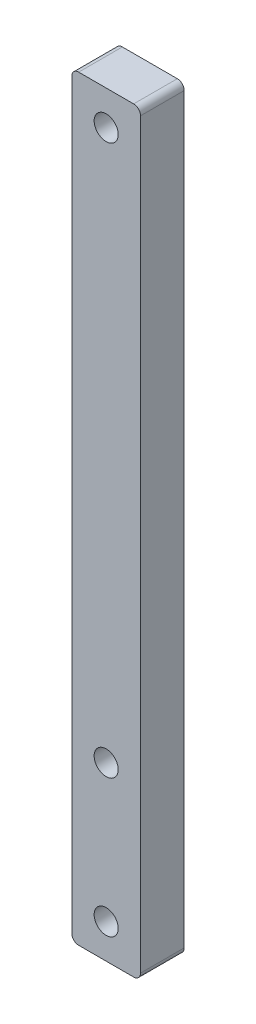
ISO-10303-21;
HEADER;
FILE_DESCRIPTION(('STEP AP214'),'2;1');
FILE_NAME('part.step','',(''),(''),'','','');
FILE_SCHEMA(('AUTOMOTIVE_DESIGN { 1 0 10303 214 1 1 1 1 }'));
ENDSEC;
DATA;
#1=APPLICATION_CONTEXT('core data for automotive mechanical design processes');
#2=APPLICATION_PROTOCOL_DEFINITION('international standard','automotive_design',2000,#1);
#3=PRODUCT_CONTEXT('',#1,'mechanical');
#4=PRODUCT('Part','Part','',(#3));
#5=PRODUCT_RELATED_PRODUCT_CATEGORY('part','',(#4));
#6=PRODUCT_DEFINITION_FORMATION('','',#4);
#7=PRODUCT_DEFINITION_CONTEXT('part definition',#1,'design');
#8=PRODUCT_DEFINITION('design','',#6,#7);
#9=PRODUCT_DEFINITION_SHAPE('','',#8);
#10=(LENGTH_UNIT() NAMED_UNIT(*) SI_UNIT(.MILLI.,.METRE.));
#11=(NAMED_UNIT(*) PLANE_ANGLE_UNIT() SI_UNIT($,.RADIAN.));
#12=(NAMED_UNIT(*) SI_UNIT($,.STERADIAN.) SOLID_ANGLE_UNIT());
#13=UNCERTAINTY_MEASURE_WITH_UNIT(LENGTH_MEASURE(1.E-05),#10,'distance_accuracy_value','');
#14=(GEOMETRIC_REPRESENTATION_CONTEXT(3) GLOBAL_UNCERTAINTY_ASSIGNED_CONTEXT((#13)) GLOBAL_UNIT_ASSIGNED_CONTEXT((#10,
#11,#12)) REPRESENTATION_CONTEXT('',''));
#15=CARTESIAN_POINT('',(0.,0.,0.));
#16=DIRECTION('',(0.,0.,1.));
#17=DIRECTION('',(1.,0.,0.));
#18=AXIS2_PLACEMENT_3D('',#15,#16,#17);
#19=CARTESIAN_POINT('',(1.,1.,6.35));
#20=DIRECTION('',(0.,0.,-1.));
#21=DIRECTION('',(-1.,0.,0.));
#22=AXIS2_PLACEMENT_3D('',#19,#20,#21);
#23=PLANE('',#22);
#24=CARTESIAN_POINT('',(5.,25.,6.35));
#25=DIRECTION('',(0.,0.,1.));
#26=DIRECTION('',(1.,0.,0.));
#27=AXIS2_PLACEMENT_3D('',#24,#25,#26);
#28=CIRCLE('',#27,1.75);
#29=CARTESIAN_POINT('',(6.75,25.,6.35));
#30=VERTEX_POINT('',#29);
#31=EDGE_CURVE('E191',#30,#30,#28,.T.);
#32=ORIENTED_EDGE('',*,*,#31,.F.);
#33=EDGE_LOOP('',(#32));
#34=FACE_BOUND('',#33,.T.);
#35=CARTESIAN_POINT('',(1.,1.,6.35));
#36=DIRECTION('',(0.,0.,1.));
#37=DIRECTION('',(-1.,0.,0.));
#38=AXIS2_PLACEMENT_3D('',#35,#36,#37);
#39=CIRCLE('',#38,1.);
#40=CARTESIAN_POINT('',(0.,1.00000000000001,6.35));
#41=VERTEX_POINT('',#40);
#42=CARTESIAN_POINT('',(1.00000000000001,0.,6.35));
#43=VERTEX_POINT('',#42);
#44=EDGE_CURVE('E145',#41,#43,#39,.T.);
#45=ORIENTED_EDGE('',*,*,#44,.T.);
#46=DIRECTION('',(1.,0.,0.));
#47=VECTOR('',#46,1.);
#48=CARTESIAN_POINT('',(1.00000000000001,0.,6.35));
#49=LINE('',#48,#47);
#50=CARTESIAN_POINT('',(8.99999999999999,0.,6.35));
#51=VERTEX_POINT('',#50);
#52=EDGE_CURVE('E93',#43,#51,#49,.T.);
#53=ORIENTED_EDGE('',*,*,#52,.T.);
#54=CARTESIAN_POINT('',(9.,1.,6.35));
#55=DIRECTION('',(0.,0.,1.));
#56=DIRECTION('',(-1.,0.,0.));
#57=AXIS2_PLACEMENT_3D('',#54,#55,#56);
#58=CIRCLE('',#57,1.);
#59=CARTESIAN_POINT('',(10.,1.00000000000001,6.35));
#60=VERTEX_POINT('',#59);
#61=EDGE_CURVE('E161',#51,#60,#58,.T.);
#62=ORIENTED_EDGE('',*,*,#61,.T.);
#63=DIRECTION('',(0.,1.,0.));
#64=VECTOR('',#63,1.);
#65=CARTESIAN_POINT('',(10.,1.00000000000001,6.35));
#66=LINE('',#65,#64);
#67=CARTESIAN_POINT('',(10.,109.,6.35));
#68=VERTEX_POINT('',#67);
#69=EDGE_CURVE('E174',#60,#68,#66,.T.);
#70=ORIENTED_EDGE('',*,*,#69,.T.);
#71=CARTESIAN_POINT('',(9.,109.,6.35));
#72=DIRECTION('',(0.,0.,1.));
#73=DIRECTION('',(-1.,0.,0.));
#74=AXIS2_PLACEMENT_3D('',#71,#72,#73);
#75=CIRCLE('',#74,1.);
#76=CARTESIAN_POINT('',(8.99999999999999,110.,6.35));
#77=VERTEX_POINT('',#76);
#78=EDGE_CURVE('E112',#68,#77,#75,.T.);
#79=ORIENTED_EDGE('',*,*,#78,.T.);
#80=DIRECTION('',(-1.,0.,0.));
#81=VECTOR('',#80,1.);
#82=CARTESIAN_POINT('',(1.00000000000001,110.,6.35));
#83=LINE('',#82,#81);
#84=CARTESIAN_POINT('',(1.00000000000001,110.,6.35));
#85=VERTEX_POINT('',#84);
#86=EDGE_CURVE('E106',#77,#85,#83,.T.);
#87=ORIENTED_EDGE('',*,*,#86,.T.);
#88=CARTESIAN_POINT('',(1.,109.,6.35));
#89=DIRECTION('',(0.,0.,1.));
#90=DIRECTION('',(-1.,0.,0.));
#91=AXIS2_PLACEMENT_3D('',#88,#89,#90);
#92=CIRCLE('',#91,1.);
#93=CARTESIAN_POINT('',(0.,109.,6.35));
#94=VERTEX_POINT('',#93);
#95=EDGE_CURVE('E110',#85,#94,#92,.T.);
#96=ORIENTED_EDGE('',*,*,#95,.T.);
#97=DIRECTION('',(0.,-1.,0.));
#98=VECTOR('',#97,1.);
#99=CARTESIAN_POINT('',(0.,1.00000000000001,6.35));
#100=LINE('',#99,#98);
#101=EDGE_CURVE('E50',#94,#41,#100,.T.);
#102=ORIENTED_EDGE('',*,*,#101,.T.);
#103=EDGE_LOOP('',(#45,#53,#62,#70,#79,#87,#96,#102));
#104=FACE_BOUND('',#103,.T.);
#105=CARTESIAN_POINT('',(5.,105.,6.35));
#106=DIRECTION('',(0.,0.,1.));
#107=DIRECTION('',(1.,0.,0.));
#108=AXIS2_PLACEMENT_3D('',#105,#106,#107);
#109=CIRCLE('',#108,1.75);
#110=CARTESIAN_POINT('',(6.75,105.,6.35));
#111=VERTEX_POINT('',#110);
#112=EDGE_CURVE('E134',#111,#111,#109,.T.);
#113=ORIENTED_EDGE('',*,*,#112,.F.);
#114=EDGE_LOOP('',(#113));
#115=FACE_BOUND('',#114,.T.);
#116=CARTESIAN_POINT('',(5.,5.,6.35));
#117=DIRECTION('',(0.,0.,1.));
#118=DIRECTION('',(1.,0.,0.));
#119=AXIS2_PLACEMENT_3D('',#116,#117,#118);
#120=CIRCLE('',#119,1.75);
#121=CARTESIAN_POINT('',(6.75,5.,6.35));
#122=VERTEX_POINT('',#121);
#123=EDGE_CURVE('E183',#122,#122,#120,.T.);
#124=ORIENTED_EDGE('',*,*,#123,.F.);
#125=EDGE_LOOP('',(#124));
#126=FACE_BOUND('',#125,.T.);
#127=ADVANCED_FACE('F32',(#34,#104,#115,#126),#23,.F.);
#128=CARTESIAN_POINT('',(1.,1.,0.));
#129=DIRECTION('',(0.,0.,-1.));
#130=DIRECTION('',(-1.,0.,0.));
#131=AXIS2_PLACEMENT_3D('',#128,#129,#130);
#132=PLANE('',#131);
#133=CARTESIAN_POINT('',(5.,25.,0.));
#134=DIRECTION('',(0.,0.,-1.));
#135=DIRECTION('',(-1.,0.,0.));
#136=AXIS2_PLACEMENT_3D('',#133,#134,#135);
#137=CIRCLE('',#136,1.75);
#138=CARTESIAN_POINT('',(3.25,25.,0.));
#139=VERTEX_POINT('',#138);
#140=EDGE_CURVE('E36',#139,#139,#137,.T.);
#141=ORIENTED_EDGE('',*,*,#140,.F.);
#142=EDGE_LOOP('',(#141));
#143=FACE_BOUND('',#142,.T.);
#144=CARTESIAN_POINT('',(5.,105.,0.));
#145=DIRECTION('',(0.,0.,1.));
#146=DIRECTION('',(1.,0.,0.));
#147=AXIS2_PLACEMENT_3D('',#144,#145,#146);
#148=CIRCLE('',#147,1.75);
#149=CARTESIAN_POINT('',(6.75,105.,0.));
#150=VERTEX_POINT('',#149);
#151=EDGE_CURVE('E180',#150,#150,#148,.T.);
#152=ORIENTED_EDGE('',*,*,#151,.T.);
#153=EDGE_LOOP('',(#152));
#154=FACE_BOUND('',#153,.T.);
#155=CARTESIAN_POINT('',(1.,1.,0.));
#156=DIRECTION('',(0.,0.,1.));
#157=DIRECTION('',(-1.,0.,0.));
#158=AXIS2_PLACEMENT_3D('',#155,#156,#157);
#159=CIRCLE('',#158,1.);
#160=CARTESIAN_POINT('',(0.,1.00000000000001,0.));
#161=VERTEX_POINT('',#160);
#162=CARTESIAN_POINT('',(1.00000000000001,0.,0.));
#163=VERTEX_POINT('',#162);
#164=EDGE_CURVE('E130',#161,#163,#159,.T.);
#165=ORIENTED_EDGE('',*,*,#164,.F.);
#166=DIRECTION('',(0.,-1.,0.));
#167=VECTOR('',#166,1.);
#168=CARTESIAN_POINT('',(0.,1.00000000000001,0.));
#169=LINE('',#168,#167);
#170=CARTESIAN_POINT('',(0.,109.,0.));
#171=VERTEX_POINT('',#170);
#172=EDGE_CURVE('E85',#171,#161,#169,.T.);
#173=ORIENTED_EDGE('',*,*,#172,.F.);
#174=CARTESIAN_POINT('',(1.,109.,0.));
#175=DIRECTION('',(0.,0.,1.));
#176=DIRECTION('',(-1.,0.,0.));
#177=AXIS2_PLACEMENT_3D('',#174,#175,#176);
#178=CIRCLE('',#177,1.);
#179=CARTESIAN_POINT('',(1.00000000000001,110.,0.));
#180=VERTEX_POINT('',#179);
#181=EDGE_CURVE('E79',#180,#171,#178,.T.);
#182=ORIENTED_EDGE('',*,*,#181,.F.);
#183=DIRECTION('',(-1.,0.,0.));
#184=VECTOR('',#183,1.);
#185=CARTESIAN_POINT('',(1.00000000000001,110.,0.));
#186=LINE('',#185,#184);
#187=CARTESIAN_POINT('',(8.99999999999999,110.,0.));
#188=VERTEX_POINT('',#187);
#189=EDGE_CURVE('E120',#188,#180,#186,.T.);
#190=ORIENTED_EDGE('',*,*,#189,.F.);
#191=CARTESIAN_POINT('',(9.,109.,0.));
#192=DIRECTION('',(0.,0.,1.));
#193=DIRECTION('',(-1.,0.,0.));
#194=AXIS2_PLACEMENT_3D('',#191,#192,#193);
#195=CIRCLE('',#194,1.);
#196=CARTESIAN_POINT('',(10.,109.,0.));
#197=VERTEX_POINT('',#196);
#198=EDGE_CURVE('E140',#197,#188,#195,.T.);
#199=ORIENTED_EDGE('',*,*,#198,.F.);
#200=DIRECTION('',(0.,1.,0.));
#201=VECTOR('',#200,1.);
#202=CARTESIAN_POINT('',(10.,1.00000000000001,0.));
#203=LINE('',#202,#201);
#204=CARTESIAN_POINT('',(10.,1.00000000000001,0.));
#205=VERTEX_POINT('',#204);
#206=EDGE_CURVE('E138',#205,#197,#203,.T.);
#207=ORIENTED_EDGE('',*,*,#206,.F.);
#208=CARTESIAN_POINT('',(9.,1.,0.));
#209=DIRECTION('',(0.,0.,1.));
#210=DIRECTION('',(-1.,0.,0.));
#211=AXIS2_PLACEMENT_3D('',#208,#209,#210);
#212=CIRCLE('',#211,1.);
#213=CARTESIAN_POINT('',(8.99999999999999,0.,0.));
#214=VERTEX_POINT('',#213);
#215=EDGE_CURVE('E136',#214,#205,#212,.T.);
#216=ORIENTED_EDGE('',*,*,#215,.F.);
#217=DIRECTION('',(1.,0.,0.));
#218=VECTOR('',#217,1.);
#219=CARTESIAN_POINT('',(1.00000000000001,0.,0.));
#220=LINE('',#219,#218);
#221=EDGE_CURVE('E133',#163,#214,#220,.T.);
#222=ORIENTED_EDGE('',*,*,#221,.F.);
#223=EDGE_LOOP('',(#165,#173,#182,#190,#199,#207,#216,#222));
#224=FACE_BOUND('',#223,.T.);
#225=CARTESIAN_POINT('',(5.,5.,0.));
#226=DIRECTION('',(0.,0.,1.));
#227=DIRECTION('',(1.,0.,0.));
#228=AXIS2_PLACEMENT_3D('',#225,#226,#227);
#229=CIRCLE('',#228,1.75);
#230=CARTESIAN_POINT('',(6.75,5.,0.));
#231=VERTEX_POINT('',#230);
#232=EDGE_CURVE('E186',#231,#231,#229,.T.);
#233=ORIENTED_EDGE('',*,*,#232,.T.);
#234=EDGE_LOOP('',(#233));
#235=FACE_BOUND('',#234,.T.);
#236=ADVANCED_FACE('F165',(#143,#154,#224,#235),#132,.T.);
#237=CARTESIAN_POINT('',(1.,1.,6.35));
#238=DIRECTION('',(0.,0.,-1.));
#239=DIRECTION('',(-1.,0.,0.));
#240=AXIS2_PLACEMENT_3D('',#237,#238,#239);
#241=CYLINDRICAL_SURFACE('',#240,1.);
#242=ORIENTED_EDGE('',*,*,#164,.T.);
#243=DIRECTION('',(0.,0.,-1.));
#244=VECTOR('',#243,1.);
#245=CARTESIAN_POINT('',(1.00000000000001,0.,6.35));
#246=LINE('',#245,#244);
#247=EDGE_CURVE('E11',#43,#163,#246,.T.);
#248=ORIENTED_EDGE('',*,*,#247,.F.);
#249=ORIENTED_EDGE('',*,*,#44,.F.);
#250=DIRECTION('',(0.,0.,-1.));
#251=VECTOR('',#250,1.);
#252=CARTESIAN_POINT('',(0.,1.00000000000001,6.35));
#253=LINE('',#252,#251);
#254=EDGE_CURVE('E126',#41,#161,#253,.T.);
#255=ORIENTED_EDGE('',*,*,#254,.T.);
#256=EDGE_LOOP('',(#242,#248,#249,#255));
#257=FACE_BOUND('',#256,.T.);
#258=ADVANCED_FACE('F34',(#257),#241,.T.);
#259=CARTESIAN_POINT('',(1.00000000000001,0.,6.35));
#260=DIRECTION('',(0.,1.,0.));
#261=DIRECTION('',(0.,0.,1.));
#262=AXIS2_PLACEMENT_3D('',#259,#260,#261);
#263=PLANE('',#262);
#264=ORIENTED_EDGE('',*,*,#221,.T.);
#265=DIRECTION('',(0.,0.,-1.));
#266=VECTOR('',#265,1.);
#267=CARTESIAN_POINT('',(8.99999999999999,0.,6.35));
#268=LINE('',#267,#266);
#269=EDGE_CURVE('E42',#51,#214,#268,.T.);
#270=ORIENTED_EDGE('',*,*,#269,.F.);
#271=ORIENTED_EDGE('',*,*,#52,.F.);
#272=ORIENTED_EDGE('',*,*,#247,.T.);
#273=EDGE_LOOP('',(#264,#270,#271,#272));
#274=FACE_BOUND('',#273,.T.);
#275=ADVANCED_FACE('F233',(#274),#263,.F.);
#276=CARTESIAN_POINT('',(9.,1.,6.35));
#277=DIRECTION('',(0.,0.,-1.));
#278=DIRECTION('',(-1.,0.,0.));
#279=AXIS2_PLACEMENT_3D('',#276,#277,#278);
#280=CYLINDRICAL_SURFACE('',#279,1.);
#281=ORIENTED_EDGE('',*,*,#215,.T.);
#282=DIRECTION('',(0.,0.,-1.));
#283=VECTOR('',#282,1.);
#284=CARTESIAN_POINT('',(10.,1.00000000000001,6.35));
#285=LINE('',#284,#283);
#286=EDGE_CURVE('E152',#60,#205,#285,.T.);
#287=ORIENTED_EDGE('',*,*,#286,.F.);
#288=ORIENTED_EDGE('',*,*,#61,.F.);
#289=ORIENTED_EDGE('',*,*,#269,.T.);
#290=EDGE_LOOP('',(#281,#287,#288,#289));
#291=FACE_BOUND('',#290,.T.);
#292=ADVANCED_FACE('F159',(#291),#280,.T.);
#293=CARTESIAN_POINT('',(10.,1.00000000000001,6.35));
#294=DIRECTION('',(-1.,0.,0.));
#295=DIRECTION('',(0.,0.,1.));
#296=AXIS2_PLACEMENT_3D('',#293,#294,#295);
#297=PLANE('',#296);
#298=ORIENTED_EDGE('',*,*,#206,.T.);
#299=DIRECTION('',(0.,0.,-1.));
#300=VECTOR('',#299,1.);
#301=CARTESIAN_POINT('',(10.,109.,6.35));
#302=LINE('',#301,#300);
#303=EDGE_CURVE('E149',#68,#197,#302,.T.);
#304=ORIENTED_EDGE('',*,*,#303,.F.);
#305=ORIENTED_EDGE('',*,*,#69,.F.);
#306=ORIENTED_EDGE('',*,*,#286,.T.);
#307=EDGE_LOOP('',(#298,#304,#305,#306));
#308=FACE_BOUND('',#307,.T.);
#309=ADVANCED_FACE('F170',(#308),#297,.F.);
#310=CARTESIAN_POINT('',(9.,109.,6.35));
#311=DIRECTION('',(0.,0.,-1.));
#312=DIRECTION('',(-1.,0.,0.));
#313=AXIS2_PLACEMENT_3D('',#310,#311,#312);
#314=CYLINDRICAL_SURFACE('',#313,1.);
#315=ORIENTED_EDGE('',*,*,#198,.T.);
#316=DIRECTION('',(0.,0.,-1.));
#317=VECTOR('',#316,1.);
#318=CARTESIAN_POINT('',(8.99999999999999,110.,6.35));
#319=LINE('',#318,#317);
#320=EDGE_CURVE('E121',#77,#188,#319,.T.);
#321=ORIENTED_EDGE('',*,*,#320,.F.);
#322=ORIENTED_EDGE('',*,*,#78,.F.);
#323=ORIENTED_EDGE('',*,*,#303,.T.);
#324=EDGE_LOOP('',(#315,#321,#322,#323));
#325=FACE_BOUND('',#324,.T.);
#326=ADVANCED_FACE('F173',(#325),#314,.T.);
#327=CARTESIAN_POINT('',(1.00000000000001,110.,6.35));
#328=DIRECTION('',(0.,-1.,0.));
#329=DIRECTION('',(0.,0.,-1.));
#330=AXIS2_PLACEMENT_3D('',#327,#328,#329);
#331=PLANE('',#330);
#332=ORIENTED_EDGE('',*,*,#189,.T.);
#333=DIRECTION('',(0.,0.,-1.));
#334=VECTOR('',#333,1.);
#335=CARTESIAN_POINT('',(1.00000000000001,110.,6.35));
#336=LINE('',#335,#334);
#337=EDGE_CURVE('E117',#85,#180,#336,.T.);
#338=ORIENTED_EDGE('',*,*,#337,.F.);
#339=ORIENTED_EDGE('',*,*,#86,.F.);
#340=ORIENTED_EDGE('',*,*,#320,.T.);
#341=EDGE_LOOP('',(#332,#338,#339,#340));
#342=FACE_BOUND('',#341,.T.);
#343=ADVANCED_FACE('F118',(#342),#331,.F.);
#344=CARTESIAN_POINT('',(1.,109.,6.35));
#345=DIRECTION('',(0.,0.,-1.));
#346=DIRECTION('',(-1.,0.,0.));
#347=AXIS2_PLACEMENT_3D('',#344,#345,#346);
#348=CYLINDRICAL_SURFACE('',#347,1.);
#349=ORIENTED_EDGE('',*,*,#181,.T.);
#350=DIRECTION('',(0.,0.,-1.));
#351=VECTOR('',#350,1.);
#352=CARTESIAN_POINT('',(0.,109.,6.35));
#353=LINE('',#352,#351);
#354=EDGE_CURVE('E122',#94,#171,#353,.T.);
#355=ORIENTED_EDGE('',*,*,#354,.F.);
#356=ORIENTED_EDGE('',*,*,#95,.F.);
#357=ORIENTED_EDGE('',*,*,#337,.T.);
#358=EDGE_LOOP('',(#349,#355,#356,#357));
#359=FACE_BOUND('',#358,.T.);
#360=ADVANCED_FACE('F124',(#359),#348,.T.);
#361=CARTESIAN_POINT('',(0.,1.00000000000001,6.35));
#362=DIRECTION('',(1.,0.,0.));
#363=DIRECTION('',(0.,0.,-1.));
#364=AXIS2_PLACEMENT_3D('',#361,#362,#363);
#365=PLANE('',#364);
#366=ORIENTED_EDGE('',*,*,#172,.T.);
#367=ORIENTED_EDGE('',*,*,#254,.F.);
#368=ORIENTED_EDGE('',*,*,#101,.F.);
#369=ORIENTED_EDGE('',*,*,#354,.T.);
#370=EDGE_LOOP('',(#366,#367,#368,#369));
#371=FACE_BOUND('',#370,.T.);
#372=ADVANCED_FACE('F208',(#371),#365,.F.);
#373=CARTESIAN_POINT('',(5.,105.,6.35));
#374=DIRECTION('',(0.,0.,-1.));
#375=DIRECTION('',(-1.,0.,0.));
#376=AXIS2_PLACEMENT_3D('',#373,#374,#375);
#377=CYLINDRICAL_SURFACE('',#376,1.75);
#378=ORIENTED_EDGE('',*,*,#112,.T.);
#379=EDGE_LOOP('',(#378));
#380=FACE_BOUND('',#379,.T.);
#381=ORIENTED_EDGE('',*,*,#151,.F.);
#382=EDGE_LOOP('',(#381));
#383=FACE_BOUND('',#382,.T.);
#384=ADVANCED_FACE('F205',(#380,#383),#377,.F.);
#385=CARTESIAN_POINT('',(5.,5.,6.35));
#386=DIRECTION('',(0.,0.,-1.));
#387=DIRECTION('',(-1.,0.,0.));
#388=AXIS2_PLACEMENT_3D('',#385,#386,#387);
#389=CYLINDRICAL_SURFACE('',#388,1.75);
#390=ORIENTED_EDGE('',*,*,#123,.T.);
#391=EDGE_LOOP('',(#390));
#392=FACE_BOUND('',#391,.T.);
#393=ORIENTED_EDGE('',*,*,#232,.F.);
#394=EDGE_LOOP('',(#393));
#395=FACE_BOUND('',#394,.T.);
#396=ADVANCED_FACE('F207',(#392,#395),#389,.F.);
#397=CARTESIAN_POINT('',(5.,25.,-3.65));
#398=DIRECTION('',(0.,0.,1.));
#399=DIRECTION('',(1.,0.,0.));
#400=AXIS2_PLACEMENT_3D('',#397,#398,#399);
#401=CYLINDRICAL_SURFACE('',#400,1.75);
#402=ORIENTED_EDGE('',*,*,#140,.T.);
#403=EDGE_LOOP('',(#402));
#404=FACE_BOUND('',#403,.T.);
#405=ORIENTED_EDGE('',*,*,#31,.T.);
#406=EDGE_LOOP('',(#405));
#407=FACE_BOUND('',#406,.T.);
#408=ADVANCED_FACE('F198',(#404,#407),#401,.F.);
#409=CLOSED_SHELL('',(#127,#236,#258,#275,#292,#309,#326,#343,#360,#372,#384,#396,#408));
#410=MANIFOLD_SOLID_BREP('B2',#409);
#411=ADVANCED_BREP_SHAPE_REPRESENTATION('',(#18,#410),#14);
#412=SHAPE_DEFINITION_REPRESENTATION(#9,#411);
ENDSEC;
END-ISO-10303-21;
